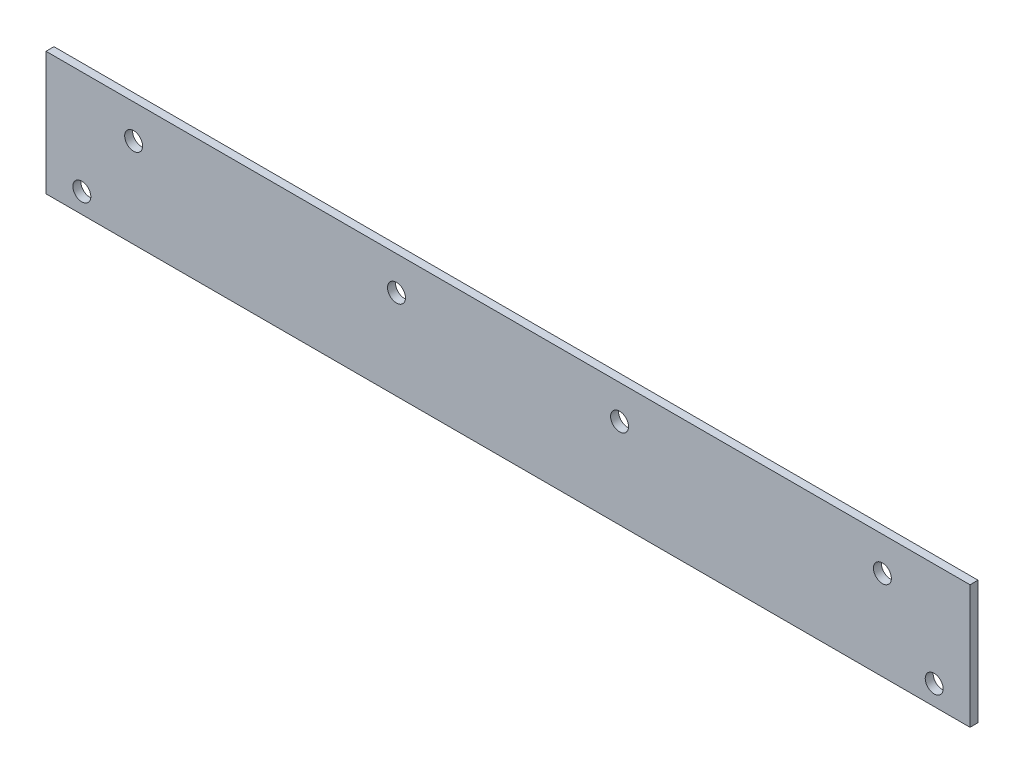
ISO-10303-21;
HEADER;
FILE_DESCRIPTION(('STEP AP214'),'2;1');
FILE_NAME('part.step','',(''),(''),'','','');
FILE_SCHEMA(('AUTOMOTIVE_DESIGN { 1 0 10303 214 1 1 1 1 }'));
ENDSEC;
DATA;
#1=APPLICATION_CONTEXT('core data for automotive mechanical design processes');
#2=APPLICATION_PROTOCOL_DEFINITION('international standard','automotive_design',2000,#1);
#3=PRODUCT_CONTEXT('',#1,'mechanical');
#4=PRODUCT('Part','Part','',(#3));
#5=PRODUCT_RELATED_PRODUCT_CATEGORY('part','',(#4));
#6=PRODUCT_DEFINITION_FORMATION('','',#4);
#7=PRODUCT_DEFINITION_CONTEXT('part definition',#1,'design');
#8=PRODUCT_DEFINITION('design','',#6,#7);
#9=PRODUCT_DEFINITION_SHAPE('','',#8);
#10=(LENGTH_UNIT() NAMED_UNIT(*) SI_UNIT(.MILLI.,.METRE.));
#11=(NAMED_UNIT(*) PLANE_ANGLE_UNIT() SI_UNIT($,.RADIAN.));
#12=(NAMED_UNIT(*) SI_UNIT($,.STERADIAN.) SOLID_ANGLE_UNIT());
#13=UNCERTAINTY_MEASURE_WITH_UNIT(LENGTH_MEASURE(1.E-05),#10,'distance_accuracy_value','');
#14=(GEOMETRIC_REPRESENTATION_CONTEXT(3) GLOBAL_UNCERTAINTY_ASSIGNED_CONTEXT((#13)) GLOBAL_UNIT_ASSIGNED_CONTEXT((#10,
#11,#12)) REPRESENTATION_CONTEXT('',''));
#15=CARTESIAN_POINT('',(0.,0.,0.));
#16=DIRECTION('',(0.,0.,1.));
#17=DIRECTION('',(1.,0.,0.));
#18=AXIS2_PLACEMENT_3D('',#15,#16,#17);
#19=CARTESIAN_POINT('',(-116.,15.5,2.00000000000001));
#20=DIRECTION('',(0.,0.,-1.));
#21=DIRECTION('',(-1.,0.,0.));
#22=AXIS2_PLACEMENT_3D('',#19,#20,#21);
#23=PLANE('',#22);
#24=CARTESIAN_POINT('',(-107.,-10.5,2.));
#25=DIRECTION('',(0.,0.,1.));
#26=DIRECTION('',(1.,0.,0.));
#27=AXIS2_PLACEMENT_3D('',#24,#25,#26);
#28=CIRCLE('',#27,2.25);
#29=CARTESIAN_POINT('',(-104.75,-10.5,2.));
#30=VERTEX_POINT('',#29);
#31=EDGE_CURVE('E133',#30,#30,#28,.T.);
#32=ORIENTED_EDGE('',*,*,#31,.F.);
#33=EDGE_LOOP('',(#32));
#34=FACE_BOUND('',#33,.T.);
#35=CARTESIAN_POINT('',(-94.,7.00000000000002,2.));
#36=DIRECTION('',(0.,0.,1.));
#37=DIRECTION('',(1.,0.,0.));
#38=AXIS2_PLACEMENT_3D('',#35,#36,#37);
#39=CIRCLE('',#38,2.25);
#40=CARTESIAN_POINT('',(-91.75,7.00000000000002,2.));
#41=VERTEX_POINT('',#40);
#42=EDGE_CURVE('E121',#41,#41,#39,.T.);
#43=ORIENTED_EDGE('',*,*,#42,.F.);
#44=EDGE_LOOP('',(#43));
#45=FACE_BOUND('',#44,.T.);
#46=CARTESIAN_POINT('',(-28.,7.00000000000002,2.));
#47=DIRECTION('',(0.,0.,1.));
#48=DIRECTION('',(1.,0.,0.));
#49=AXIS2_PLACEMENT_3D('',#46,#47,#48);
#50=CIRCLE('',#49,2.25);
#51=CARTESIAN_POINT('',(-25.75,7.00000000000002,2.));
#52=VERTEX_POINT('',#51);
#53=EDGE_CURVE('E100',#52,#52,#50,.T.);
#54=ORIENTED_EDGE('',*,*,#53,.F.);
#55=EDGE_LOOP('',(#54));
#56=FACE_BOUND('',#55,.T.);
#57=DIRECTION('',(0.,-1.,0.));
#58=VECTOR('',#57,1.);
#59=CARTESIAN_POINT('',(-116.,-15.5,2.));
#60=LINE('',#59,#58);
#61=CARTESIAN_POINT('',(-116.,15.5,2.00000000000001));
#62=VERTEX_POINT('',#61);
#63=CARTESIAN_POINT('',(-116.,-15.5,2.));
#64=VERTEX_POINT('',#63);
#65=EDGE_CURVE('E85',#62,#64,#60,.T.);
#66=ORIENTED_EDGE('',*,*,#65,.T.);
#67=DIRECTION('',(1.,0.,0.));
#68=VECTOR('',#67,1.);
#69=CARTESIAN_POINT('',(-116.,-15.5,2.));
#70=LINE('',#69,#68);
#71=CARTESIAN_POINT('',(116.,-15.5,2.));
#72=VERTEX_POINT('',#71);
#73=EDGE_CURVE('E80',#64,#72,#70,.T.);
#74=ORIENTED_EDGE('',*,*,#73,.T.);
#75=DIRECTION('',(0.,1.,0.));
#76=VECTOR('',#75,1.);
#77=CARTESIAN_POINT('',(116.,-15.5,2.));
#78=LINE('',#77,#76);
#79=CARTESIAN_POINT('',(116.,15.5,2.00000000000001));
#80=VERTEX_POINT('',#79);
#81=EDGE_CURVE('E83',#72,#80,#78,.T.);
#82=ORIENTED_EDGE('',*,*,#81,.T.);
#83=DIRECTION('',(-1.,0.,0.));
#84=VECTOR('',#83,1.);
#85=CARTESIAN_POINT('',(-116.,15.5,2.00000000000001));
#86=LINE('',#85,#84);
#87=EDGE_CURVE('E50',#80,#62,#86,.T.);
#88=ORIENTED_EDGE('',*,*,#87,.T.);
#89=EDGE_LOOP('',(#66,#74,#82,#88));
#90=FACE_BOUND('',#89,.T.);
#91=CARTESIAN_POINT('',(28.,7.00000000000002,2.));
#92=DIRECTION('',(0.,0.,1.));
#93=DIRECTION('',(1.,0.,0.));
#94=AXIS2_PLACEMENT_3D('',#91,#92,#93);
#95=CIRCLE('',#94,2.25);
#96=CARTESIAN_POINT('',(30.25,7.00000000000002,2.));
#97=VERTEX_POINT('',#96);
#98=EDGE_CURVE('E115',#97,#97,#95,.T.);
#99=ORIENTED_EDGE('',*,*,#98,.F.);
#100=EDGE_LOOP('',(#99));
#101=FACE_BOUND('',#100,.T.);
#102=CARTESIAN_POINT('',(94.,7.00000000000004,2.));
#103=DIRECTION('',(0.,0.,1.));
#104=DIRECTION('',(-1.,0.,0.));
#105=AXIS2_PLACEMENT_3D('',#102,#103,#104);
#106=CIRCLE('',#105,2.25);
#107=CARTESIAN_POINT('',(91.75,7.00000000000004,2.));
#108=VERTEX_POINT('',#107);
#109=EDGE_CURVE('E127',#108,#108,#106,.T.);
#110=ORIENTED_EDGE('',*,*,#109,.F.);
#111=EDGE_LOOP('',(#110));
#112=FACE_BOUND('',#111,.T.);
#113=CARTESIAN_POINT('',(107.,-10.5,2.));
#114=DIRECTION('',(0.,0.,1.));
#115=DIRECTION('',(1.,0.,0.));
#116=AXIS2_PLACEMENT_3D('',#113,#114,#115);
#117=CIRCLE('',#116,2.25);
#118=CARTESIAN_POINT('',(109.25,-10.5,2.));
#119=VERTEX_POINT('',#118);
#120=EDGE_CURVE('E139',#119,#119,#117,.T.);
#121=ORIENTED_EDGE('',*,*,#120,.F.);
#122=EDGE_LOOP('',(#121));
#123=FACE_BOUND('',#122,.T.);
#124=ADVANCED_FACE('F33',(#34,#45,#56,#90,#101,#112,#123),#23,.F.);
#125=CARTESIAN_POINT('',(-116.,15.5,0.));
#126=DIRECTION('',(0.,0.,-1.));
#127=DIRECTION('',(-1.,0.,0.));
#128=AXIS2_PLACEMENT_3D('',#125,#126,#127);
#129=PLANE('',#128);
#130=CARTESIAN_POINT('',(-107.,-10.5,0.));
#131=DIRECTION('',(0.,0.,1.));
#132=DIRECTION('',(1.,0.,0.));
#133=AXIS2_PLACEMENT_3D('',#130,#131,#132);
#134=CIRCLE('',#133,2.25);
#135=CARTESIAN_POINT('',(-104.75,-10.5,0.));
#136=VERTEX_POINT('',#135);
#137=EDGE_CURVE('E136',#136,#136,#134,.T.);
#138=ORIENTED_EDGE('',*,*,#137,.T.);
#139=EDGE_LOOP('',(#138));
#140=FACE_BOUND('',#139,.T.);
#141=CARTESIAN_POINT('',(-94.,7.00000000000002,0.));
#142=DIRECTION('',(0.,0.,1.));
#143=DIRECTION('',(1.,0.,0.));
#144=AXIS2_PLACEMENT_3D('',#141,#142,#143);
#145=CIRCLE('',#144,2.25);
#146=CARTESIAN_POINT('',(-91.75,7.00000000000002,0.));
#147=VERTEX_POINT('',#146);
#148=EDGE_CURVE('E124',#147,#147,#145,.T.);
#149=ORIENTED_EDGE('',*,*,#148,.T.);
#150=EDGE_LOOP('',(#149));
#151=FACE_BOUND('',#150,.T.);
#152=CARTESIAN_POINT('',(-28.,7.00000000000002,0.));
#153=DIRECTION('',(0.,0.,1.));
#154=DIRECTION('',(1.,0.,0.));
#155=AXIS2_PLACEMENT_3D('',#152,#153,#154);
#156=CIRCLE('',#155,2.25);
#157=CARTESIAN_POINT('',(-25.75,7.00000000000002,0.));
#158=VERTEX_POINT('',#157);
#159=EDGE_CURVE('E112',#158,#158,#156,.T.);
#160=ORIENTED_EDGE('',*,*,#159,.T.);
#161=EDGE_LOOP('',(#160));
#162=FACE_BOUND('',#161,.T.);
#163=DIRECTION('',(0.,-1.,0.));
#164=VECTOR('',#163,1.);
#165=CARTESIAN_POINT('',(-116.,-15.5,0.));
#166=LINE('',#165,#164);
#167=CARTESIAN_POINT('',(-116.,15.5,0.));
#168=VERTEX_POINT('',#167);
#169=CARTESIAN_POINT('',(-116.,-15.5,0.));
#170=VERTEX_POINT('',#169);
#171=EDGE_CURVE('E97',#168,#170,#166,.T.);
#172=ORIENTED_EDGE('',*,*,#171,.F.);
#173=DIRECTION('',(-1.,0.,0.));
#174=VECTOR('',#173,1.);
#175=CARTESIAN_POINT('',(-116.,15.5,0.));
#176=LINE('',#175,#174);
#177=CARTESIAN_POINT('',(116.,15.5,0.));
#178=VERTEX_POINT('',#177);
#179=EDGE_CURVE('E73',#178,#168,#176,.T.);
#180=ORIENTED_EDGE('',*,*,#179,.F.);
#181=DIRECTION('',(0.,1.,0.));
#182=VECTOR('',#181,1.);
#183=CARTESIAN_POINT('',(116.,-15.5,0.));
#184=LINE('',#183,#182);
#185=CARTESIAN_POINT('',(116.,-15.5,0.));
#186=VERTEX_POINT('',#185);
#187=EDGE_CURVE('E67',#186,#178,#184,.T.);
#188=ORIENTED_EDGE('',*,*,#187,.F.);
#189=DIRECTION('',(1.,0.,0.));
#190=VECTOR('',#189,1.);
#191=CARTESIAN_POINT('',(-116.,-15.5,0.));
#192=LINE('',#191,#190);
#193=EDGE_CURVE('E89',#170,#186,#192,.T.);
#194=ORIENTED_EDGE('',*,*,#193,.F.);
#195=EDGE_LOOP('',(#172,#180,#188,#194));
#196=FACE_BOUND('',#195,.T.);
#197=CARTESIAN_POINT('',(28.,7.00000000000002,0.));
#198=DIRECTION('',(0.,0.,1.));
#199=DIRECTION('',(1.,0.,0.));
#200=AXIS2_PLACEMENT_3D('',#197,#198,#199);
#201=CIRCLE('',#200,2.25);
#202=CARTESIAN_POINT('',(30.25,7.00000000000002,0.));
#203=VERTEX_POINT('',#202);
#204=EDGE_CURVE('E118',#203,#203,#201,.T.);
#205=ORIENTED_EDGE('',*,*,#204,.T.);
#206=EDGE_LOOP('',(#205));
#207=FACE_BOUND('',#206,.T.);
#208=CARTESIAN_POINT('',(94.,7.00000000000004,0.));
#209=DIRECTION('',(0.,0.,1.));
#210=DIRECTION('',(-1.,0.,0.));
#211=AXIS2_PLACEMENT_3D('',#208,#209,#210);
#212=CIRCLE('',#211,2.25);
#213=CARTESIAN_POINT('',(91.75,7.00000000000004,0.));
#214=VERTEX_POINT('',#213);
#215=EDGE_CURVE('E130',#214,#214,#212,.T.);
#216=ORIENTED_EDGE('',*,*,#215,.T.);
#217=EDGE_LOOP('',(#216));
#218=FACE_BOUND('',#217,.T.);
#219=CARTESIAN_POINT('',(107.,-10.5,0.));
#220=DIRECTION('',(0.,0.,1.));
#221=DIRECTION('',(1.,0.,0.));
#222=AXIS2_PLACEMENT_3D('',#219,#220,#221);
#223=CIRCLE('',#222,2.25);
#224=CARTESIAN_POINT('',(109.25,-10.5,0.));
#225=VERTEX_POINT('',#224);
#226=EDGE_CURVE('E142',#225,#225,#223,.T.);
#227=ORIENTED_EDGE('',*,*,#226,.T.);
#228=EDGE_LOOP('',(#227));
#229=FACE_BOUND('',#228,.T.);
#230=ADVANCED_FACE('F108',(#140,#151,#162,#196,#207,#218,#229),#129,.T.);
#231=CARTESIAN_POINT('',(-116.,-15.5,2.));
#232=DIRECTION('',(1.,0.,0.));
#233=DIRECTION('',(0.,0.,-1.));
#234=AXIS2_PLACEMENT_3D('',#231,#232,#233);
#235=PLANE('',#234);
#236=ORIENTED_EDGE('',*,*,#171,.T.);
#237=DIRECTION('',(0.,0.,-1.));
#238=VECTOR('',#237,1.);
#239=CARTESIAN_POINT('',(-116.,-15.5,2.));
#240=LINE('',#239,#238);
#241=EDGE_CURVE('E11',#64,#170,#240,.T.);
#242=ORIENTED_EDGE('',*,*,#241,.F.);
#243=ORIENTED_EDGE('',*,*,#65,.F.);
#244=DIRECTION('',(0.,0.,-1.));
#245=VECTOR('',#244,1.);
#246=CARTESIAN_POINT('',(-116.,15.5,2.00000000000001));
#247=LINE('',#246,#245);
#248=EDGE_CURVE('E93',#62,#168,#247,.T.);
#249=ORIENTED_EDGE('',*,*,#248,.T.);
#250=EDGE_LOOP('',(#236,#242,#243,#249));
#251=FACE_BOUND('',#250,.T.);
#252=ADVANCED_FACE('F35',(#251),#235,.F.);
#253=CARTESIAN_POINT('',(-116.,-15.5,2.));
#254=DIRECTION('',(0.,1.,0.));
#255=DIRECTION('',(-1.,0.,0.));
#256=AXIS2_PLACEMENT_3D('',#253,#254,#255);
#257=PLANE('',#256);
#258=ORIENTED_EDGE('',*,*,#193,.T.);
#259=DIRECTION('',(0.,0.,-1.));
#260=VECTOR('',#259,1.);
#261=CARTESIAN_POINT('',(116.,-15.5,2.));
#262=LINE('',#261,#260);
#263=EDGE_CURVE('E42',#72,#186,#262,.T.);
#264=ORIENTED_EDGE('',*,*,#263,.F.);
#265=ORIENTED_EDGE('',*,*,#73,.F.);
#266=ORIENTED_EDGE('',*,*,#241,.T.);
#267=EDGE_LOOP('',(#258,#264,#265,#266));
#268=FACE_BOUND('',#267,.T.);
#269=ADVANCED_FACE('F88',(#268),#257,.F.);
#270=CARTESIAN_POINT('',(116.,-15.5,2.));
#271=DIRECTION('',(-1.,0.,0.));
#272=DIRECTION('',(0.,0.,1.));
#273=AXIS2_PLACEMENT_3D('',#270,#271,#272);
#274=PLANE('',#273);
#275=ORIENTED_EDGE('',*,*,#187,.T.);
#276=DIRECTION('',(0.,0.,-1.));
#277=VECTOR('',#276,1.);
#278=CARTESIAN_POINT('',(116.,15.5,2.00000000000001));
#279=LINE('',#278,#277);
#280=EDGE_CURVE('E90',#80,#178,#279,.T.);
#281=ORIENTED_EDGE('',*,*,#280,.F.);
#282=ORIENTED_EDGE('',*,*,#81,.F.);
#283=ORIENTED_EDGE('',*,*,#263,.T.);
#284=EDGE_LOOP('',(#275,#281,#282,#283));
#285=FACE_BOUND('',#284,.T.);
#286=ADVANCED_FACE('F91',(#285),#274,.F.);
#287=CARTESIAN_POINT('',(-116.,15.5,2.00000000000001));
#288=DIRECTION('',(0.,-1.,0.));
#289=DIRECTION('',(1.,0.,0.));
#290=AXIS2_PLACEMENT_3D('',#287,#288,#289);
#291=PLANE('',#290);
#292=ORIENTED_EDGE('',*,*,#179,.T.);
#293=ORIENTED_EDGE('',*,*,#248,.F.);
#294=ORIENTED_EDGE('',*,*,#87,.F.);
#295=ORIENTED_EDGE('',*,*,#280,.T.);
#296=EDGE_LOOP('',(#292,#293,#294,#295));
#297=FACE_BOUND('',#296,.T.);
#298=ADVANCED_FACE('F105',(#297),#291,.F.);
#299=CARTESIAN_POINT('',(-28.,7.00000000000002,2.));
#300=DIRECTION('',(0.,0.,-1.));
#301=DIRECTION('',(-1.,0.,0.));
#302=AXIS2_PLACEMENT_3D('',#299,#300,#301);
#303=CYLINDRICAL_SURFACE('',#302,2.25);
#304=ORIENTED_EDGE('',*,*,#53,.T.);
#305=EDGE_LOOP('',(#304));
#306=FACE_BOUND('',#305,.T.);
#307=ORIENTED_EDGE('',*,*,#159,.F.);
#308=EDGE_LOOP('',(#307));
#309=FACE_BOUND('',#308,.T.);
#310=ADVANCED_FACE('F162',(#306,#309),#303,.F.);
#311=CARTESIAN_POINT('',(28.,7.00000000000002,2.));
#312=DIRECTION('',(0.,0.,-1.));
#313=DIRECTION('',(-1.,0.,0.));
#314=AXIS2_PLACEMENT_3D('',#311,#312,#313);
#315=CYLINDRICAL_SURFACE('',#314,2.25);
#316=ORIENTED_EDGE('',*,*,#98,.T.);
#317=EDGE_LOOP('',(#316));
#318=FACE_BOUND('',#317,.T.);
#319=ORIENTED_EDGE('',*,*,#204,.F.);
#320=EDGE_LOOP('',(#319));
#321=FACE_BOUND('',#320,.T.);
#322=ADVANCED_FACE('F197',(#318,#321),#315,.F.);
#323=CARTESIAN_POINT('',(-94.,7.00000000000002,2.));
#324=DIRECTION('',(0.,0.,-1.));
#325=DIRECTION('',(-1.,0.,0.));
#326=AXIS2_PLACEMENT_3D('',#323,#324,#325);
#327=CYLINDRICAL_SURFACE('',#326,2.25);
#328=ORIENTED_EDGE('',*,*,#42,.T.);
#329=EDGE_LOOP('',(#328));
#330=FACE_BOUND('',#329,.T.);
#331=ORIENTED_EDGE('',*,*,#148,.F.);
#332=EDGE_LOOP('',(#331));
#333=FACE_BOUND('',#332,.T.);
#334=ADVANCED_FACE('F204',(#330,#333),#327,.F.);
#335=CARTESIAN_POINT('',(94.,7.00000000000004,2.));
#336=DIRECTION('',(0.,0.,-1.));
#337=DIRECTION('',(-1.,0.,0.));
#338=AXIS2_PLACEMENT_3D('',#335,#336,#337);
#339=CYLINDRICAL_SURFACE('',#338,2.25);
#340=ORIENTED_EDGE('',*,*,#109,.T.);
#341=EDGE_LOOP('',(#340));
#342=FACE_BOUND('',#341,.T.);
#343=ORIENTED_EDGE('',*,*,#215,.F.);
#344=EDGE_LOOP('',(#343));
#345=FACE_BOUND('',#344,.T.);
#346=ADVANCED_FACE('F211',(#342,#345),#339,.F.);
#347=CARTESIAN_POINT('',(-107.,-10.5,2.));
#348=DIRECTION('',(0.,0.,-1.));
#349=DIRECTION('',(-1.,0.,0.));
#350=AXIS2_PLACEMENT_3D('',#347,#348,#349);
#351=CYLINDRICAL_SURFACE('',#350,2.25);
#352=ORIENTED_EDGE('',*,*,#31,.T.);
#353=EDGE_LOOP('',(#352));
#354=FACE_BOUND('',#353,.T.);
#355=ORIENTED_EDGE('',*,*,#137,.F.);
#356=EDGE_LOOP('',(#355));
#357=FACE_BOUND('',#356,.T.);
#358=ADVANCED_FACE('F219',(#354,#357),#351,.F.);
#359=CARTESIAN_POINT('',(107.,-10.5,2.));
#360=DIRECTION('',(0.,0.,-1.));
#361=DIRECTION('',(-1.,0.,0.));
#362=AXIS2_PLACEMENT_3D('',#359,#360,#361);
#363=CYLINDRICAL_SURFACE('',#362,2.25);
#364=ORIENTED_EDGE('',*,*,#120,.T.);
#365=EDGE_LOOP('',(#364));
#366=FACE_BOUND('',#365,.T.);
#367=ORIENTED_EDGE('',*,*,#226,.F.);
#368=EDGE_LOOP('',(#367));
#369=FACE_BOUND('',#368,.T.);
#370=ADVANCED_FACE('F148',(#366,#369),#363,.F.);
#371=CLOSED_SHELL('',(#124,#230,#252,#269,#286,#298,#310,#322,#334,#346,#358,#370));
#372=MANIFOLD_SOLID_BREP('B2',#371);
#373=ADVANCED_BREP_SHAPE_REPRESENTATION('',(#18,#372),#14);
#374=SHAPE_DEFINITION_REPRESENTATION(#9,#373);
ENDSEC;
END-ISO-10303-21;
